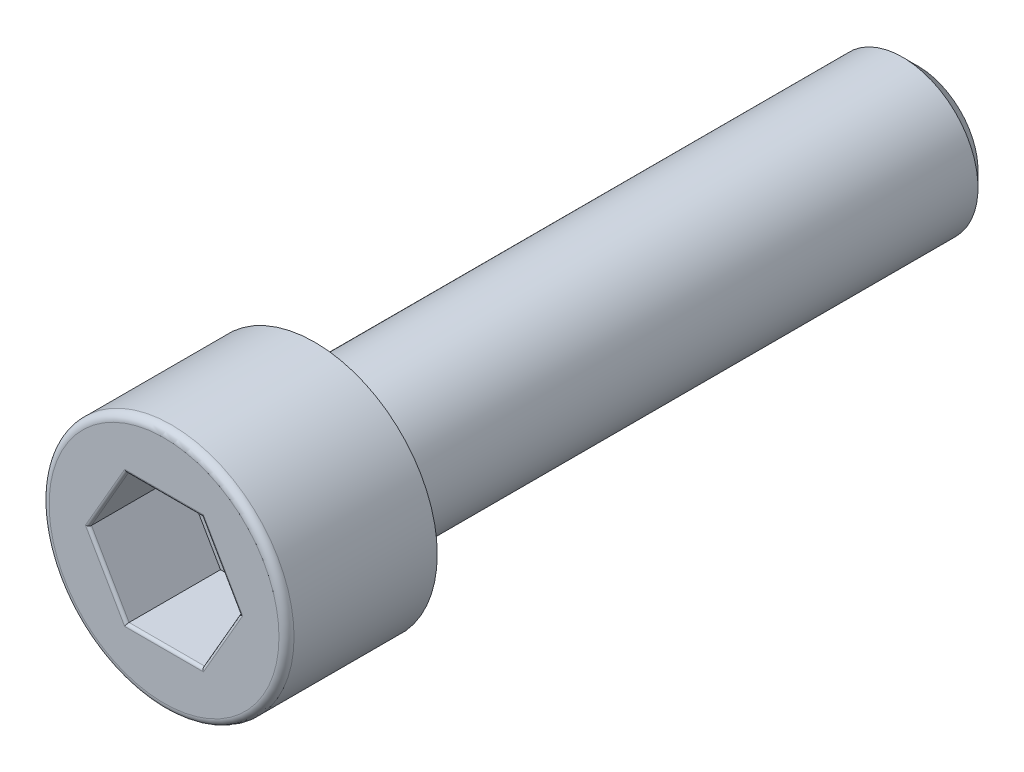
ISO-10303-21;
HEADER;
FILE_DESCRIPTION(('STEP AP214'),'2;1');
FILE_NAME('part.step','',(''),(''),'','','');
FILE_SCHEMA(('AUTOMOTIVE_DESIGN { 1 0 10303 214 1 1 1 1 }'));
ENDSEC;
DATA;
#1=APPLICATION_CONTEXT('core data for automotive mechanical design processes');
#2=APPLICATION_PROTOCOL_DEFINITION('international standard','automotive_design',2000,#1);
#3=PRODUCT_CONTEXT('',#1,'mechanical');
#4=PRODUCT('Part','Part','',(#3));
#5=PRODUCT_RELATED_PRODUCT_CATEGORY('part','',(#4));
#6=PRODUCT_DEFINITION_FORMATION('','',#4);
#7=PRODUCT_DEFINITION_CONTEXT('part definition',#1,'design');
#8=PRODUCT_DEFINITION('design','',#6,#7);
#9=PRODUCT_DEFINITION_SHAPE('','',#8);
#10=(LENGTH_UNIT() NAMED_UNIT(*) SI_UNIT(.MILLI.,.METRE.));
#11=(NAMED_UNIT(*) PLANE_ANGLE_UNIT() SI_UNIT($,.RADIAN.));
#12=(NAMED_UNIT(*) SI_UNIT($,.STERADIAN.) SOLID_ANGLE_UNIT());
#13=UNCERTAINTY_MEASURE_WITH_UNIT(LENGTH_MEASURE(1.E-05),#10,'distance_accuracy_value','');
#14=(GEOMETRIC_REPRESENTATION_CONTEXT(3) GLOBAL_UNCERTAINTY_ASSIGNED_CONTEXT((#13)) GLOBAL_UNIT_ASSIGNED_CONTEXT((#10,
#11,#12)) REPRESENTATION_CONTEXT('',''));
#15=CARTESIAN_POINT('',(0.,0.,0.));
#16=DIRECTION('',(0.,0.,1.));
#17=DIRECTION('',(1.,0.,0.));
#18=AXIS2_PLACEMENT_3D('',#15,#16,#17);
#19=CARTESIAN_POINT('',(0.,0.,0.));
#20=DIRECTION('',(0.,0.,1.));
#21=DIRECTION('',(1.,0.,0.));
#22=AXIS2_PLACEMENT_3D('',#19,#20,#21);
#23=PLANE('',#22);
#24=CARTESIAN_POINT('',(0.,0.,0.));
#25=DIRECTION('',(0.,0.,1.));
#26=DIRECTION('',(1.,0.,0.));
#27=AXIS2_PLACEMENT_3D('',#24,#25,#26);
#28=CIRCLE('',#27,6.5);
#29=CARTESIAN_POINT('',(6.5,0.,0.));
#30=VERTEX_POINT('',#29);
#31=EDGE_CURVE('E115',#30,#30,#28,.T.);
#32=ORIENTED_EDGE('',*,*,#31,.F.);
#33=EDGE_LOOP('',(#32));
#34=FACE_BOUND('',#33,.T.);
#35=CARTESIAN_POINT('',(0.,0.,0.));
#36=DIRECTION('',(0.,0.,-1.));
#37=DIRECTION('',(-1.,0.,0.));
#38=AXIS2_PLACEMENT_3D('',#35,#36,#37);
#39=CIRCLE('',#38,4.);
#40=CARTESIAN_POINT('',(-4.,0.,0.));
#41=VERTEX_POINT('',#40);
#42=EDGE_CURVE('E183',#41,#41,#39,.T.);
#43=ORIENTED_EDGE('',*,*,#42,.F.);
#44=EDGE_LOOP('',(#43));
#45=FACE_BOUND('',#44,.T.);
#46=ADVANCED_FACE('F33',(#34,#45),#23,.F.);
#47=CARTESIAN_POINT('',(0.,0.,8.));
#48=DIRECTION('',(0.,0.,1.));
#49=DIRECTION('',(1.,0.,0.));
#50=AXIS2_PLACEMENT_3D('',#47,#48,#49);
#51=PLANE('',#50);
#52=DIRECTION('',(0.499481595986428,-0.866324497674429,0.));
#53=VECTOR('',#52,1.);
#54=CARTESIAN_POINT('',(3.13202121573457,1.80577481036022,8.));
#55=LINE('',#54,#53);
#56=CARTESIAN_POINT('',(2.09080748269175,3.61170514192451,8.));
#57=VERTEX_POINT('',#56);
#58=CARTESIAN_POINT('',(4.173145282631,0.,8.));
#59=VERTEX_POINT('',#58);
#60=EDGE_CURVE('E161',#57,#59,#55,.T.);
#61=ORIENTED_EDGE('',*,*,#60,.T.);
#62=DIRECTION('',(-0.499481595986428,-0.866324497674429,0.));
#63=VECTOR('',#62,1.);
#64=CARTESIAN_POINT('',(3.13202121573457,-1.80577481036022,8.));
#65=LINE('',#64,#63);
#66=CARTESIAN_POINT('',(2.09080748269175,-3.61170514192451,8.));
#67=VERTEX_POINT('',#66);
#68=EDGE_CURVE('E171',#59,#67,#65,.T.);
#69=ORIENTED_EDGE('',*,*,#68,.T.);
#70=DIRECTION('',(-1.,0.,0.));
#71=VECTOR('',#70,1.);
#72=CARTESIAN_POINT('',(0.,-3.61170514192451,8.));
#73=LINE('',#72,#71);
#74=CARTESIAN_POINT('',(-2.09080748269177,-3.6117051419245,8.));
#75=VERTEX_POINT('',#74);
#76=EDGE_CURVE('E169',#67,#75,#73,.T.);
#77=ORIENTED_EDGE('',*,*,#76,.T.);
#78=DIRECTION('',(-0.499481595986426,0.86632449767443,0.));
#79=VECTOR('',#78,1.);
#80=CARTESIAN_POINT('',(-3.13202121573458,-1.80577481036021,8.));
#81=LINE('',#80,#79);
#82=CARTESIAN_POINT('',(-4.173145282631,0.,8.));
#83=VERTEX_POINT('',#82);
#84=EDGE_CURVE('E167',#75,#83,#81,.T.);
#85=ORIENTED_EDGE('',*,*,#84,.T.);
#86=DIRECTION('',(0.499481595986428,0.866324497674429,0.));
#87=VECTOR('',#86,1.);
#88=CARTESIAN_POINT('',(-3.13202121573457,1.80577481036022,8.));
#89=LINE('',#88,#87);
#90=CARTESIAN_POINT('',(-2.09080748269175,3.61170514192451,8.));
#91=VERTEX_POINT('',#90);
#92=EDGE_CURVE('E165',#83,#91,#89,.T.);
#93=ORIENTED_EDGE('',*,*,#92,.T.);
#94=DIRECTION('',(1.,0.,0.));
#95=VECTOR('',#94,1.);
#96=CARTESIAN_POINT('',(0.,3.61170514192451,8.));
#97=LINE('',#96,#95);
#98=EDGE_CURVE('E163',#91,#57,#97,.T.);
#99=ORIENTED_EDGE('',*,*,#98,.T.);
#100=EDGE_LOOP('',(#61,#69,#77,#85,#93,#99));
#101=FACE_BOUND('',#100,.T.);
#102=CARTESIAN_POINT('',(0.,0.,8.));
#103=DIRECTION('',(0.,0.,1.));
#104=DIRECTION('',(1.,0.,0.));
#105=AXIS2_PLACEMENT_3D('',#102,#103,#104);
#106=CIRCLE('',#105,6.1);
#107=CARTESIAN_POINT('',(6.1,0.,8.));
#108=VERTEX_POINT('',#107);
#109=EDGE_CURVE('E155',#108,#108,#106,.T.);
#110=ORIENTED_EDGE('',*,*,#109,.T.);
#111=EDGE_LOOP('',(#110));
#112=FACE_BOUND('',#111,.T.);
#113=ADVANCED_FACE('F236',(#101,#112),#51,.T.);
#114=CARTESIAN_POINT('',(0.,0.,8.));
#115=DIRECTION('',(0.,0.,-1.));
#116=DIRECTION('',(-1.,0.,0.));
#117=AXIS2_PLACEMENT_3D('',#114,#115,#116);
#118=CYLINDRICAL_SURFACE('',#117,6.5);
#119=CARTESIAN_POINT('',(0.,0.,7.6));
#120=DIRECTION('',(0.,0.,1.));
#121=DIRECTION('',(1.,0.,0.));
#122=AXIS2_PLACEMENT_3D('',#119,#120,#121);
#123=CIRCLE('',#122,6.5);
#124=CARTESIAN_POINT('',(6.5,0.,7.6));
#125=VERTEX_POINT('',#124);
#126=EDGE_CURVE('E158',#125,#125,#123,.F.);
#127=ORIENTED_EDGE('',*,*,#126,.T.);
#128=EDGE_LOOP('',(#127));
#129=FACE_BOUND('',#128,.T.);
#130=ORIENTED_EDGE('',*,*,#31,.T.);
#131=EDGE_LOOP('',(#130));
#132=FACE_BOUND('',#131,.T.);
#133=ADVANCED_FACE('F35',(#129,#132),#118,.T.);
#134=CARTESIAN_POINT('',(-2.00414508216682,-3.4617051419245,3.));
#135=DIRECTION('',(0.86632449767443,0.499481595986426,0.));
#136=DIRECTION('',(-0.499481595986426,0.86632449767443,0.));
#137=AXIS2_PLACEMENT_3D('',#134,#135,#136);
#138=PLANE('',#137);
#139=DIRECTION('',(0.,0.,1.));
#140=VECTOR('',#139,1.);
#141=CARTESIAN_POINT('',(-4.,0.,3.));
#142=LINE('',#141,#140);
#143=CARTESIAN_POINT('',(-4.,0.,3.));
#144=VERTEX_POINT('',#143);
#145=CARTESIAN_POINT('',(-4.,0.,7.85));
#146=VERTEX_POINT('',#145);
#147=EDGE_CURVE('E105',#144,#146,#142,.T.);
#148=ORIENTED_EDGE('',*,*,#147,.T.);
#149=DIRECTION('',(-0.499481595986426,0.86632449767443,0.));
#150=VECTOR('',#149,1.);
#151=CARTESIAN_POINT('',(-2.00414508216682,-3.4617051419245,7.85));
#152=LINE('',#151,#150);
#153=CARTESIAN_POINT('',(-2.00414508216682,-3.4617051419245,7.85));
#154=VERTEX_POINT('',#153);
#155=EDGE_CURVE('E179',#146,#154,#152,.F.);
#156=ORIENTED_EDGE('',*,*,#155,.T.);
#157=DIRECTION('',(0.,0.,1.));
#158=VECTOR('',#157,1.);
#159=CARTESIAN_POINT('',(-2.00414508216682,-3.4617051419245,3.));
#160=LINE('',#159,#158);
#161=CARTESIAN_POINT('',(-2.00414508216682,-3.4617051419245,3.));
#162=VERTEX_POINT('',#161);
#163=EDGE_CURVE('E122',#162,#154,#160,.T.);
#164=ORIENTED_EDGE('',*,*,#163,.F.);
#165=DIRECTION('',(-0.499481595986426,0.86632449767443,0.));
#166=VECTOR('',#165,1.);
#167=CARTESIAN_POINT('',(-2.00414508216682,-3.4617051419245,3.));
#168=LINE('',#167,#166);
#169=EDGE_CURVE('E119',#162,#144,#168,.T.);
#170=ORIENTED_EDGE('',*,*,#169,.T.);
#171=EDGE_LOOP('',(#148,#156,#164,#170));
#172=FACE_BOUND('',#171,.T.);
#173=ADVANCED_FACE('F120',(#172),#138,.T.);
#174=CARTESIAN_POINT('',(-4.,0.,3.));
#175=DIRECTION('',(0.866324497674428,-0.499481595986428,0.));
#176=DIRECTION('',(0.499481595986428,0.866324497674429,0.));
#177=AXIS2_PLACEMENT_3D('',#174,#175,#176);
#178=PLANE('',#177);
#179=DIRECTION('',(0.,0.,1.));
#180=VECTOR('',#179,1.);
#181=CARTESIAN_POINT('',(-2.00414508216681,3.46170514192451,3.));
#182=LINE('',#181,#180);
#183=CARTESIAN_POINT('',(-2.00414508216681,3.46170514192451,3.));
#184=VERTEX_POINT('',#183);
#185=CARTESIAN_POINT('',(-2.00414508216681,3.46170514192451,7.85));
#186=VERTEX_POINT('',#185);
#187=EDGE_CURVE('E116',#184,#186,#182,.T.);
#188=ORIENTED_EDGE('',*,*,#187,.T.);
#189=DIRECTION('',(0.499481595986428,0.866324497674429,0.));
#190=VECTOR('',#189,1.);
#191=CARTESIAN_POINT('',(-4.,0.,7.85));
#192=LINE('',#191,#190);
#193=EDGE_CURVE('E112',#186,#146,#192,.F.);
#194=ORIENTED_EDGE('',*,*,#193,.T.);
#195=ORIENTED_EDGE('',*,*,#147,.F.);
#196=DIRECTION('',(0.499481595986428,0.866324497674428,0.));
#197=VECTOR('',#196,1.);
#198=CARTESIAN_POINT('',(-4.,0.,3.));
#199=LINE('',#198,#197);
#200=EDGE_CURVE('E109',#144,#184,#199,.T.);
#201=ORIENTED_EDGE('',*,*,#200,.T.);
#202=EDGE_LOOP('',(#188,#194,#195,#201));
#203=FACE_BOUND('',#202,.T.);
#204=ADVANCED_FACE('F107',(#203),#178,.T.);
#205=CARTESIAN_POINT('',(-2.00414508216681,3.46170514192451,3.));
#206=DIRECTION('',(0.,-1.,0.));
#207=DIRECTION('',(0.,0.,-1.));
#208=AXIS2_PLACEMENT_3D('',#205,#206,#207);
#209=PLANE('',#208);
#210=DIRECTION('',(0.,0.,1.));
#211=VECTOR('',#210,1.);
#212=CARTESIAN_POINT('',(2.00414508216681,3.46170514192451,3.));
#213=LINE('',#212,#211);
#214=CARTESIAN_POINT('',(2.00414508216681,3.46170514192451,3.));
#215=VERTEX_POINT('',#214);
#216=CARTESIAN_POINT('',(2.00414508216681,3.46170514192451,7.85));
#217=VERTEX_POINT('',#216);
#218=EDGE_CURVE('E150',#215,#217,#213,.T.);
#219=ORIENTED_EDGE('',*,*,#218,.T.);
#220=DIRECTION('',(1.,0.,0.));
#221=VECTOR('',#220,1.);
#222=CARTESIAN_POINT('',(-2.00414508216681,3.46170514192451,7.85));
#223=LINE('',#222,#221);
#224=EDGE_CURVE('E55',#217,#186,#223,.F.);
#225=ORIENTED_EDGE('',*,*,#224,.T.);
#226=ORIENTED_EDGE('',*,*,#187,.F.);
#227=DIRECTION('',(1.,0.,0.));
#228=VECTOR('',#227,1.);
#229=CARTESIAN_POINT('',(-2.00414508216681,3.46170514192451,3.));
#230=LINE('',#229,#228);
#231=EDGE_CURVE('E131',#184,#215,#230,.T.);
#232=ORIENTED_EDGE('',*,*,#231,.T.);
#233=EDGE_LOOP('',(#219,#225,#226,#232));
#234=FACE_BOUND('',#233,.T.);
#235=ADVANCED_FACE('F226',(#234),#209,.T.);
#236=CARTESIAN_POINT('',(2.00414508216681,3.46170514192451,3.));
#237=DIRECTION('',(-0.866324497674428,-0.499481595986428,0.));
#238=DIRECTION('',(0.499481595986428,-0.866324497674429,0.));
#239=AXIS2_PLACEMENT_3D('',#236,#237,#238);
#240=PLANE('',#239);
#241=DIRECTION('',(0.,0.,1.));
#242=VECTOR('',#241,1.);
#243=CARTESIAN_POINT('',(4.,0.,3.));
#244=LINE('',#243,#242);
#245=CARTESIAN_POINT('',(4.,0.,3.));
#246=VERTEX_POINT('',#245);
#247=CARTESIAN_POINT('',(4.,0.,7.85));
#248=VERTEX_POINT('',#247);
#249=EDGE_CURVE('E148',#246,#248,#244,.T.);
#250=ORIENTED_EDGE('',*,*,#249,.T.);
#251=DIRECTION('',(0.499481595986428,-0.866324497674429,0.));
#252=VECTOR('',#251,1.);
#253=CARTESIAN_POINT('',(2.00414508216681,3.46170514192451,7.85));
#254=LINE('',#253,#252);
#255=EDGE_CURVE('E48',#248,#217,#254,.F.);
#256=ORIENTED_EDGE('',*,*,#255,.T.);
#257=ORIENTED_EDGE('',*,*,#218,.F.);
#258=DIRECTION('',(0.499481595986428,-0.866324497674428,0.));
#259=VECTOR('',#258,1.);
#260=CARTESIAN_POINT('',(2.00414508216681,3.46170514192451,3.));
#261=LINE('',#260,#259);
#262=EDGE_CURVE('E133',#215,#246,#261,.T.);
#263=ORIENTED_EDGE('',*,*,#262,.T.);
#264=EDGE_LOOP('',(#250,#256,#257,#263));
#265=FACE_BOUND('',#264,.T.);
#266=ADVANCED_FACE('F225',(#265),#240,.T.);
#267=CARTESIAN_POINT('',(4.,0.,3.));
#268=DIRECTION('',(-0.866324497674428,0.499481595986428,0.));
#269=DIRECTION('',(-0.499481595986428,-0.866324497674429,0.));
#270=AXIS2_PLACEMENT_3D('',#267,#268,#269);
#271=PLANE('',#270);
#272=DIRECTION('',(0.,0.,1.));
#273=VECTOR('',#272,1.);
#274=CARTESIAN_POINT('',(2.00414508216681,-3.46170514192451,3.));
#275=LINE('',#274,#273);
#276=CARTESIAN_POINT('',(2.00414508216681,-3.46170514192451,3.));
#277=VERTEX_POINT('',#276);
#278=CARTESIAN_POINT('',(2.00414508216681,-3.46170514192451,7.85));
#279=VERTEX_POINT('',#278);
#280=EDGE_CURVE('E145',#277,#279,#275,.T.);
#281=ORIENTED_EDGE('',*,*,#280,.T.);
#282=DIRECTION('',(-0.499481595986428,-0.866324497674429,0.));
#283=VECTOR('',#282,1.);
#284=CARTESIAN_POINT('',(4.,0.,7.85));
#285=LINE('',#284,#283);
#286=EDGE_CURVE('E174',#279,#248,#285,.F.);
#287=ORIENTED_EDGE('',*,*,#286,.T.);
#288=ORIENTED_EDGE('',*,*,#249,.F.);
#289=DIRECTION('',(-0.499481595986428,-0.866324497674428,0.));
#290=VECTOR('',#289,1.);
#291=CARTESIAN_POINT('',(4.,0.,3.));
#292=LINE('',#291,#290);
#293=EDGE_CURVE('E139',#246,#277,#292,.T.);
#294=ORIENTED_EDGE('',*,*,#293,.T.);
#295=EDGE_LOOP('',(#281,#287,#288,#294));
#296=FACE_BOUND('',#295,.T.);
#297=ADVANCED_FACE('F223',(#296),#271,.T.);
#298=CARTESIAN_POINT('',(2.00414508216681,-3.46170514192451,3.));
#299=DIRECTION('',(0.,1.,0.));
#300=DIRECTION('',(-1.,0.,0.));
#301=AXIS2_PLACEMENT_3D('',#298,#299,#300);
#302=PLANE('',#301);
#303=ORIENTED_EDGE('',*,*,#163,.T.);
#304=DIRECTION('',(-1.,0.,0.));
#305=VECTOR('',#304,1.);
#306=CARTESIAN_POINT('',(2.00414508216681,-3.46170514192451,7.85));
#307=LINE('',#306,#305);
#308=EDGE_CURVE('E177',#154,#279,#307,.F.);
#309=ORIENTED_EDGE('',*,*,#308,.T.);
#310=ORIENTED_EDGE('',*,*,#280,.F.);
#311=DIRECTION('',(-1.,0.,0.));
#312=VECTOR('',#311,1.);
#313=CARTESIAN_POINT('',(2.00414508216681,-3.46170514192451,3.));
#314=LINE('',#313,#312);
#315=EDGE_CURVE('E142',#277,#162,#314,.T.);
#316=ORIENTED_EDGE('',*,*,#315,.T.);
#317=EDGE_LOOP('',(#303,#309,#310,#316));
#318=FACE_BOUND('',#317,.T.);
#319=ADVANCED_FACE('F220',(#318),#302,.T.);
#320=CARTESIAN_POINT('',(-5.99585491783318,3.46170514192451,3.));
#321=DIRECTION('',(0.,0.,-1.));
#322=DIRECTION('',(-1.,0.,0.));
#323=AXIS2_PLACEMENT_3D('',#320,#321,#322);
#324=PLANE('',#323);
#325=ORIENTED_EDGE('',*,*,#169,.F.);
#326=ORIENTED_EDGE('',*,*,#315,.F.);
#327=ORIENTED_EDGE('',*,*,#293,.F.);
#328=ORIENTED_EDGE('',*,*,#262,.F.);
#329=ORIENTED_EDGE('',*,*,#231,.F.);
#330=ORIENTED_EDGE('',*,*,#200,.F.);
#331=EDGE_LOOP('',(#325,#326,#327,#328,#329,#330));
#332=FACE_BOUND('',#331,.T.);
#333=ADVANCED_FACE('F128',(#332),#324,.F.);
#334=CARTESIAN_POINT('',(0.,0.,7.6));
#335=DIRECTION('',(0.,0.,1.));
#336=DIRECTION('',(1.,0.,0.));
#337=AXIS2_PLACEMENT_3D('',#334,#335,#336);
#338=TOROIDAL_SURFACE('',#337,6.1,0.4);
#339=ORIENTED_EDGE('',*,*,#126,.F.);
#340=EDGE_LOOP('',(#339));
#341=FACE_BOUND('',#340,.T.);
#342=ORIENTED_EDGE('',*,*,#109,.F.);
#343=EDGE_LOOP('',(#342));
#344=FACE_BOUND('',#343,.T.);
#345=ADVANCED_FACE('F254',(#341,#344),#338,.T.);
#346=CARTESIAN_POINT('',(-3.13202121573457,1.80577481036022,7.85));
#347=DIRECTION('',(0.499481595986428,0.866324497674429,0.));
#348=DIRECTION('',(-0.866324497674428,0.499481595986428,0.));
#349=AXIS2_PLACEMENT_3D('',#346,#347,#348);
#350=CYLINDRICAL_SURFACE('',#349,0.15);
#351=CARTESIAN_POINT('',(-4.173145282631,0.,7.85));
#352=DIRECTION('',(0.,1.,0.));
#353=DIRECTION('',(-1.,0.,0.));
#354=AXIS2_PLACEMENT_3D('',#351,#352,#353);
#355=ELLIPSE('',#354,0.173145282631002,0.15);
#356=EDGE_CURVE('E202',#146,#83,#355,.F.);
#357=ORIENTED_EDGE('',*,*,#356,.F.);
#358=ORIENTED_EDGE('',*,*,#193,.F.);
#359=CARTESIAN_POINT('',(-2.09080748269175,3.61170514192451,7.85));
#360=DIRECTION('',(0.865875740503921,0.500259134855912,0.));
#361=DIRECTION('',(-0.500259134855912,0.865875740503921,0.));
#362=AXIS2_PLACEMENT_3D('',#359,#360,#361);
#363=ELLIPSE('',#362,0.173235018586735,0.15);
#364=EDGE_CURVE('E126',#91,#186,#363,.T.);
#365=ORIENTED_EDGE('',*,*,#364,.F.);
#366=ORIENTED_EDGE('',*,*,#92,.F.);
#367=EDGE_LOOP('',(#357,#358,#365,#366));
#368=FACE_BOUND('',#367,.T.);
#369=ADVANCED_FACE('F212',(#368),#350,.T.);
#370=CARTESIAN_POINT('',(0.,3.61170514192451,7.85));
#371=DIRECTION('',(1.,0.,0.));
#372=DIRECTION('',(0.,0.,-1.));
#373=AXIS2_PLACEMENT_3D('',#370,#371,#372);
#374=CYLINDRICAL_SURFACE('',#373,0.15);
#375=ORIENTED_EDGE('',*,*,#364,.T.);
#376=ORIENTED_EDGE('',*,*,#224,.F.);
#377=CARTESIAN_POINT('',(2.09080748269175,3.61170514192451,7.85));
#378=DIRECTION('',(0.865875740503921,-0.500259134855912,0.));
#379=DIRECTION('',(0.500259134855912,0.865875740503921,0.));
#380=AXIS2_PLACEMENT_3D('',#377,#378,#379);
#381=ELLIPSE('',#380,0.173235018586735,0.15);
#382=EDGE_CURVE('E199',#57,#217,#381,.T.);
#383=ORIENTED_EDGE('',*,*,#382,.F.);
#384=ORIENTED_EDGE('',*,*,#98,.F.);
#385=EDGE_LOOP('',(#375,#376,#383,#384));
#386=FACE_BOUND('',#385,.T.);
#387=ADVANCED_FACE('F208',(#386),#374,.T.);
#388=CARTESIAN_POINT('',(-3.13202121573458,-1.80577481036021,7.85));
#389=DIRECTION('',(-0.499481595986426,0.86632449767443,0.));
#390=DIRECTION('',(-0.86632449767443,-0.499481595986426,0.));
#391=AXIS2_PLACEMENT_3D('',#388,#389,#390);
#392=CYLINDRICAL_SURFACE('',#391,0.15);
#393=ORIENTED_EDGE('',*,*,#356,.T.);
#394=ORIENTED_EDGE('',*,*,#84,.F.);
#395=CARTESIAN_POINT('',(-2.09080748269177,-3.6117051419245,7.85));
#396=DIRECTION('',(-0.86587574050392,0.500259134855915,0.));
#397=DIRECTION('',(-0.500259134855915,-0.86587574050392,0.));
#398=AXIS2_PLACEMENT_3D('',#395,#396,#397);
#399=ELLIPSE('',#398,0.173235018586735,0.15);
#400=EDGE_CURVE('E196',#154,#75,#399,.F.);
#401=ORIENTED_EDGE('',*,*,#400,.F.);
#402=ORIENTED_EDGE('',*,*,#155,.F.);
#403=EDGE_LOOP('',(#393,#394,#401,#402));
#404=FACE_BOUND('',#403,.T.);
#405=ADVANCED_FACE('F217',(#404),#392,.T.);
#406=CARTESIAN_POINT('',(3.13202121573457,1.80577481036022,7.85));
#407=DIRECTION('',(0.499481595986428,-0.866324497674429,0.));
#408=DIRECTION('',(0.866324497674428,0.499481595986428,0.));
#409=AXIS2_PLACEMENT_3D('',#406,#407,#408);
#410=CYLINDRICAL_SURFACE('',#409,0.15);
#411=ORIENTED_EDGE('',*,*,#382,.T.);
#412=ORIENTED_EDGE('',*,*,#255,.F.);
#413=CARTESIAN_POINT('',(4.173145282631,0.,7.85));
#414=DIRECTION('',(0.,-1.,0.));
#415=DIRECTION('',(-1.,0.,0.));
#416=AXIS2_PLACEMENT_3D('',#413,#414,#415);
#417=ELLIPSE('',#416,0.173145282631002,0.15);
#418=EDGE_CURVE('E194',#59,#248,#417,.T.);
#419=ORIENTED_EDGE('',*,*,#418,.F.);
#420=ORIENTED_EDGE('',*,*,#60,.F.);
#421=EDGE_LOOP('',(#411,#412,#419,#420));
#422=FACE_BOUND('',#421,.T.);
#423=ADVANCED_FACE('F357',(#422),#410,.T.);
#424=CARTESIAN_POINT('',(0.,-3.61170514192451,7.85));
#425=DIRECTION('',(-1.,0.,0.));
#426=DIRECTION('',(0.,-1.,0.));
#427=AXIS2_PLACEMENT_3D('',#424,#425,#426);
#428=CYLINDRICAL_SURFACE('',#427,0.15);
#429=ORIENTED_EDGE('',*,*,#400,.T.);
#430=ORIENTED_EDGE('',*,*,#76,.F.);
#431=CARTESIAN_POINT('',(2.09080748269175,-3.61170514192451,7.85));
#432=DIRECTION('',(-0.865875740503922,-0.500259134855911,0.));
#433=DIRECTION('',(0.500259134855911,-0.865875740503922,0.));
#434=AXIS2_PLACEMENT_3D('',#431,#432,#433);
#435=ELLIPSE('',#434,0.173235018586735,0.15);
#436=EDGE_CURVE('E192',#279,#67,#435,.F.);
#437=ORIENTED_EDGE('',*,*,#436,.F.);
#438=ORIENTED_EDGE('',*,*,#308,.F.);
#439=EDGE_LOOP('',(#429,#430,#437,#438));
#440=FACE_BOUND('',#439,.T.);
#441=ADVANCED_FACE('F350',(#440),#428,.T.);
#442=CARTESIAN_POINT('',(3.13202121573457,-1.80577481036022,7.85));
#443=DIRECTION('',(-0.499481595986428,-0.866324497674429,0.));
#444=DIRECTION('',(0.866324497674428,-0.499481595986428,0.));
#445=AXIS2_PLACEMENT_3D('',#442,#443,#444);
#446=CYLINDRICAL_SURFACE('',#445,0.15);
#447=ORIENTED_EDGE('',*,*,#418,.T.);
#448=ORIENTED_EDGE('',*,*,#286,.F.);
#449=ORIENTED_EDGE('',*,*,#436,.T.);
#450=ORIENTED_EDGE('',*,*,#68,.F.);
#451=EDGE_LOOP('',(#447,#448,#449,#450));
#452=FACE_BOUND('',#451,.T.);
#453=ADVANCED_FACE('F314',(#452),#446,.T.);
#454=CARTESIAN_POINT('',(0.,0.,-32.));
#455=DIRECTION('',(0.,0.,1.));
#456=DIRECTION('',(1.,0.,0.));
#457=AXIS2_PLACEMENT_3D('',#454,#455,#456);
#458=CYLINDRICAL_SURFACE('',#457,4.);
#459=CARTESIAN_POINT('',(0.,0.,-31.2));
#460=DIRECTION('',(0.,0.,-1.));
#461=DIRECTION('',(-1.,0.,0.));
#462=AXIS2_PLACEMENT_3D('',#459,#460,#461);
#463=CIRCLE('',#462,4.);
#464=CARTESIAN_POINT('',(-4.,0.,-31.2));
#465=VERTEX_POINT('',#464);
#466=EDGE_CURVE('E11',#465,#465,#463,.F.);
#467=ORIENTED_EDGE('',*,*,#466,.T.);
#468=EDGE_LOOP('',(#467));
#469=FACE_BOUND('',#468,.T.);
#470=ORIENTED_EDGE('',*,*,#42,.T.);
#471=EDGE_LOOP('',(#470));
#472=FACE_BOUND('',#471,.T.);
#473=ADVANCED_FACE('F319',(#469,#472),#458,.T.);
#474=CARTESIAN_POINT('',(0.,0.,-32.));
#475=DIRECTION('',(0.,0.,-1.));
#476=DIRECTION('',(-1.,0.,0.));
#477=AXIS2_PLACEMENT_3D('',#474,#475,#476);
#478=PLANE('',#477);
#479=CARTESIAN_POINT('',(0.,0.,-32.));
#480=DIRECTION('',(0.,0.,-1.));
#481=DIRECTION('',(-1.,0.,0.));
#482=AXIS2_PLACEMENT_3D('',#479,#480,#481);
#483=CIRCLE('',#482,3.19999999999999);
#484=CARTESIAN_POINT('',(-3.19999999999999,0.,-32.));
#485=VERTEX_POINT('',#484);
#486=EDGE_CURVE('E41',#485,#485,#483,.T.);
#487=ORIENTED_EDGE('',*,*,#486,.T.);
#488=EDGE_LOOP('',(#487));
#489=FACE_BOUND('',#488,.T.);
#490=ADVANCED_FACE('F325',(#489),#478,.T.);
#491=CARTESIAN_POINT('',(0.,0.,-32.));
#492=DIRECTION('',(0.,0.,1.));
#493=DIRECTION('',(1.,0.,0.));
#494=AXIS2_PLACEMENT_3D('',#491,#492,#493);
#495=CONICAL_SURFACE('',#494,3.19999999999999,0.785398163397454);
#496=ORIENTED_EDGE('',*,*,#466,.F.);
#497=EDGE_LOOP('',(#496));
#498=FACE_BOUND('',#497,.T.);
#499=ORIENTED_EDGE('',*,*,#486,.F.);
#500=EDGE_LOOP('',(#499));
#501=FACE_BOUND('',#500,.T.);
#502=ADVANCED_FACE('F328',(#498,#501),#495,.T.);
#503=CLOSED_SHELL('',(#46,#113,#133,#173,#204,#235,#266,#297,#319,#333,#345,#369,#387,#405,#423,
#441,#453,#473,#490,#502));
#504=MANIFOLD_SOLID_BREP('B2',#503);
#505=ADVANCED_BREP_SHAPE_REPRESENTATION('',(#18,#504),#14);
#506=SHAPE_DEFINITION_REPRESENTATION(#9,#505);
ENDSEC;
END-ISO-10303-21;
